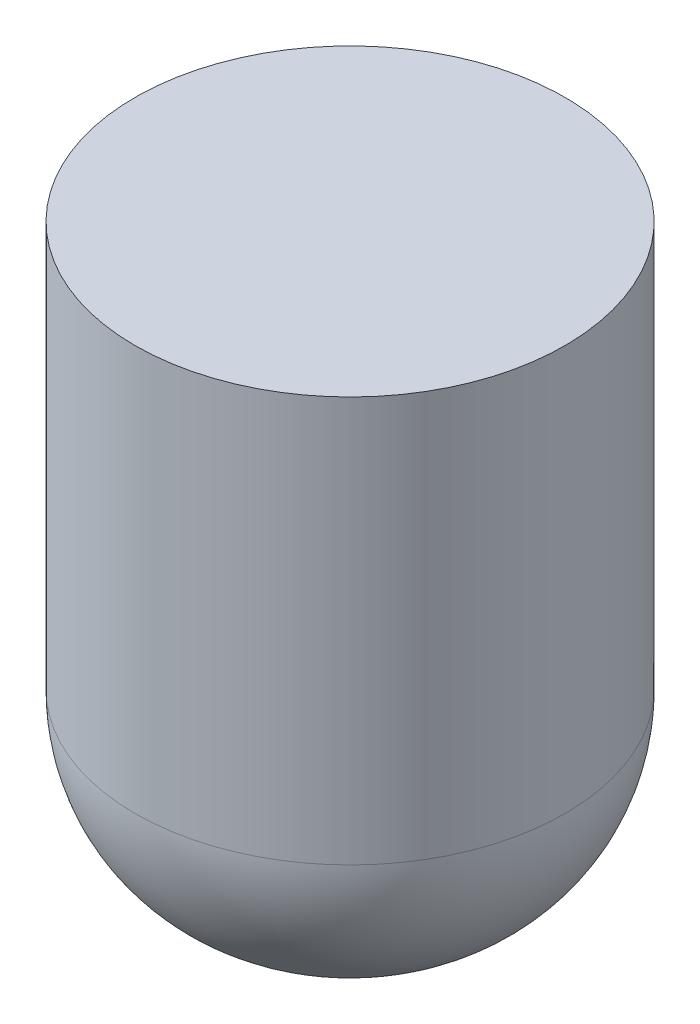
ISO-10303-21;
HEADER;
FILE_DESCRIPTION(('STEP AP214'),'2;1');
FILE_NAME('part.step','',(''),(''),'','','');
FILE_SCHEMA(('AUTOMOTIVE_DESIGN { 1 0 10303 214 1 1 1 1 }'));
ENDSEC;
DATA;
#1=APPLICATION_CONTEXT('core data for automotive mechanical design processes');
#2=APPLICATION_PROTOCOL_DEFINITION('international standard','automotive_design',2000,#1);
#3=PRODUCT_CONTEXT('',#1,'mechanical');
#4=PRODUCT('Part','Part','',(#3));
#5=PRODUCT_RELATED_PRODUCT_CATEGORY('part','',(#4));
#6=PRODUCT_DEFINITION_FORMATION('','',#4);
#7=PRODUCT_DEFINITION_CONTEXT('part definition',#1,'design');
#8=PRODUCT_DEFINITION('design','',#6,#7);
#9=PRODUCT_DEFINITION_SHAPE('','',#8);
#10=(LENGTH_UNIT() NAMED_UNIT(*) SI_UNIT(.MILLI.,.METRE.));
#11=(NAMED_UNIT(*) PLANE_ANGLE_UNIT() SI_UNIT($,.RADIAN.));
#12=(NAMED_UNIT(*) SI_UNIT($,.STERADIAN.) SOLID_ANGLE_UNIT());
#13=UNCERTAINTY_MEASURE_WITH_UNIT(LENGTH_MEASURE(1.E-05),#10,'distance_accuracy_value','');
#14=(GEOMETRIC_REPRESENTATION_CONTEXT(3) GLOBAL_UNCERTAINTY_ASSIGNED_CONTEXT((#13)) GLOBAL_UNIT_ASSIGNED_CONTEXT((#10,
#11,#12)) REPRESENTATION_CONTEXT('',''));
#15=CARTESIAN_POINT('',(0.,0.,0.));
#16=DIRECTION('',(0.,0.,1.));
#17=DIRECTION('',(1.,0.,0.));
#18=AXIS2_PLACEMENT_3D('',#15,#16,#17);
#19=CARTESIAN_POINT('',(0.,0.,0.));
#20=DIRECTION('',(0.,1.,0.));
#21=DIRECTION('',(0.,0.,1.));
#22=AXIS2_PLACEMENT_3D('',#19,#20,#21);
#23=PLANE('',#22);
#24=CARTESIAN_POINT('',(0.,0.,0.));
#25=DIRECTION('',(0.,1.,0.));
#26=DIRECTION('',(0.,0.,1.));
#27=AXIS2_PLACEMENT_3D('',#24,#25,#26);
#28=CIRCLE('',#27,130.175);
#29=CARTESIAN_POINT('',(0.,0.,130.175));
#30=VERTEX_POINT('',#29);
#31=EDGE_CURVE('E11',#30,#30,#28,.T.);
#32=ORIENTED_EDGE('',*,*,#31,.T.);
#33=EDGE_LOOP('',(#32));
#34=FACE_BOUND('',#33,.T.);
#35=ADVANCED_FACE('F37',(#34),#23,.T.);
#36=CARTESIAN_POINT('',(0.,0.,0.));
#37=DIRECTION('',(0.,1.,0.));
#38=DIRECTION('',(0.,0.,1.));
#39=AXIS2_PLACEMENT_3D('',#36,#37,#38);
#40=CYLINDRICAL_SURFACE('',#39,130.175);
#41=CARTESIAN_POINT('',(0.,-245.388815704827,0.));
#42=DIRECTION('',(0.,1.,0.));
#43=DIRECTION('',(0.,0.,1.));
#44=AXIS2_PLACEMENT_3D('',#41,#42,#43);
#45=CIRCLE('',#44,130.175);
#46=CARTESIAN_POINT('',(0.,-245.388815704827,130.175));
#47=VERTEX_POINT('',#46);
#48=EDGE_CURVE('E43',#47,#47,#45,.T.);
#49=ORIENTED_EDGE('',*,*,#48,.T.);
#50=EDGE_LOOP('',(#49));
#51=FACE_BOUND('',#50,.T.);
#52=ORIENTED_EDGE('',*,*,#31,.F.);
#53=EDGE_LOOP('',(#52));
#54=FACE_BOUND('',#53,.T.);
#55=ADVANCED_FACE('F49',(#51,#54),#40,.T.);
#56=CARTESIAN_POINT('',(0.,-245.388815704827,15.667413741162));
#57=DIRECTION('',(-1.,0.,0.));
#58=DIRECTION('',(0.,0.,1.));
#59=AXIS2_PLACEMENT_3D('',#56,#57,#58);
#60=CIRCLE('',#59,114.507586258838);
#61=TRIMMED_CURVE('',#60,(PARAMETER_VALUE(-1.70805111783118)),
(PARAMETER_VALUE(1.70805111783118)),.T.,.PARAMETER.);
#62=CARTESIAN_POINT('',(0.,-245.388815704827,0.));
#63=DIRECTION('',(0.,1.,0.));
#64=AXIS1_PLACEMENT('',#62,#63);
#65=SURFACE_OF_REVOLUTION('',#61,#64);
#66=CARTESIAN_POINT('',(0.,-358.819496992953,0.));
#67=VERTEX_POINT('',#66);
#68=VERTEX_LOOP('',#67);
#69=FACE_BOUND('',#68,.T.);
#70=ORIENTED_EDGE('',*,*,#48,.F.);
#71=EDGE_LOOP('',(#70));
#72=FACE_BOUND('',#71,.T.);
#73=ADVANCED_FACE('F46',(#69,#72),#65,.T.);
#74=CLOSED_SHELL('',(#35,#55,#73));
#75=MANIFOLD_SOLID_BREP('B2',#74);
#76=ADVANCED_BREP_SHAPE_REPRESENTATION('',(#18,#75),#14);
#77=SHAPE_DEFINITION_REPRESENTATION(#9,#76);
ENDSEC;
END-ISO-10303-21;
